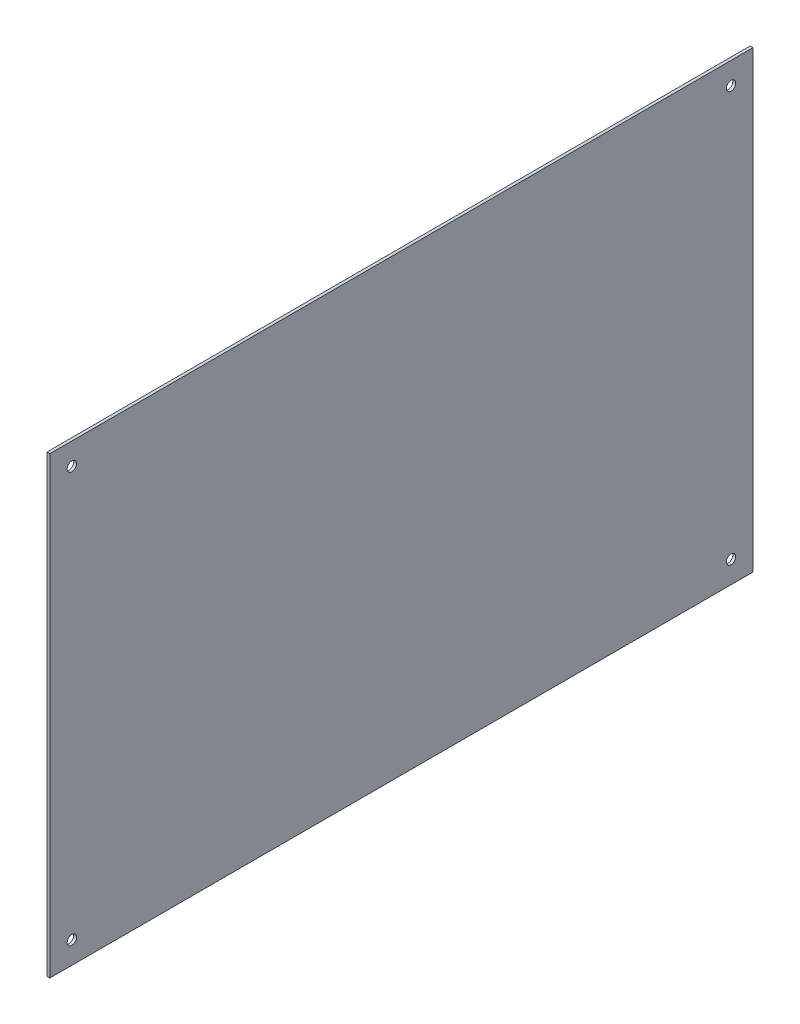
ISO-10303-21;
HEADER;
FILE_DESCRIPTION(('STEP AP214'),'2;1');
FILE_NAME('part.step','',(''),(''),'','','');
FILE_SCHEMA(('AUTOMOTIVE_DESIGN { 1 0 10303 214 1 1 1 1 }'));
ENDSEC;
DATA;
#1=APPLICATION_CONTEXT('core data for automotive mechanical design processes');
#2=APPLICATION_PROTOCOL_DEFINITION('international standard','automotive_design',2000,#1);
#3=PRODUCT_CONTEXT('',#1,'mechanical');
#4=PRODUCT('Part','Part','',(#3));
#5=PRODUCT_RELATED_PRODUCT_CATEGORY('part','',(#4));
#6=PRODUCT_DEFINITION_FORMATION('','',#4);
#7=PRODUCT_DEFINITION_CONTEXT('part definition',#1,'design');
#8=PRODUCT_DEFINITION('design','',#6,#7);
#9=PRODUCT_DEFINITION_SHAPE('','',#8);
#10=(LENGTH_UNIT() NAMED_UNIT(*) SI_UNIT(.MILLI.,.METRE.));
#11=(NAMED_UNIT(*) PLANE_ANGLE_UNIT() SI_UNIT($,.RADIAN.));
#12=(NAMED_UNIT(*) SI_UNIT($,.STERADIAN.) SOLID_ANGLE_UNIT());
#13=UNCERTAINTY_MEASURE_WITH_UNIT(LENGTH_MEASURE(1.E-05),#10,'distance_accuracy_value','');
#14=(GEOMETRIC_REPRESENTATION_CONTEXT(3) GLOBAL_UNCERTAINTY_ASSIGNED_CONTEXT((#13)) GLOBAL_UNIT_ASSIGNED_CONTEXT((#10,
#11,#12)) REPRESENTATION_CONTEXT('',''));
#15=CARTESIAN_POINT('',(0.,0.,0.));
#16=DIRECTION('',(0.,0.,1.));
#17=DIRECTION('',(1.,0.,0.));
#18=AXIS2_PLACEMENT_3D('',#15,#16,#17);
#19=CARTESIAN_POINT('',(1.,0.,0.));
#20=DIRECTION('',(-1.,0.,0.));
#21=DIRECTION('',(0.,0.,1.));
#22=AXIS2_PLACEMENT_3D('',#19,#20,#21);
#23=PLANE('',#22);
#24=DIRECTION('',(0.,1.,0.));
#25=VECTOR('',#24,1.);
#26=CARTESIAN_POINT('',(1.,-77.5,-120.));
#27=LINE('',#26,#25);
#28=CARTESIAN_POINT('',(1.,-77.5,-120.));
#29=VERTEX_POINT('',#28);
#30=CARTESIAN_POINT('',(1.,77.5,-120.));
#31=VERTEX_POINT('',#30);
#32=EDGE_CURVE('E92',#29,#31,#27,.T.);
#33=ORIENTED_EDGE('',*,*,#32,.T.);
#34=DIRECTION('',(0.,0.,1.));
#35=VECTOR('',#34,1.);
#36=CARTESIAN_POINT('',(1.,77.5,120.));
#37=LINE('',#36,#35);
#38=CARTESIAN_POINT('',(1.,77.5,120.));
#39=VERTEX_POINT('',#38);
#40=EDGE_CURVE('E87',#31,#39,#37,.T.);
#41=ORIENTED_EDGE('',*,*,#40,.T.);
#42=DIRECTION('',(0.,-1.,0.));
#43=VECTOR('',#42,1.);
#44=CARTESIAN_POINT('',(1.,-77.5,120.));
#45=LINE('',#44,#43);
#46=CARTESIAN_POINT('',(1.,-77.5,120.));
#47=VERTEX_POINT('',#46);
#48=EDGE_CURVE('E90',#39,#47,#45,.T.);
#49=ORIENTED_EDGE('',*,*,#48,.T.);
#50=DIRECTION('',(0.,0.,-1.));
#51=VECTOR('',#50,1.);
#52=CARTESIAN_POINT('',(1.,-77.5,120.));
#53=LINE('',#52,#51);
#54=EDGE_CURVE('E57',#47,#29,#53,.T.);
#55=ORIENTED_EDGE('',*,*,#54,.T.);
#56=EDGE_LOOP('',(#33,#41,#49,#55));
#57=FACE_BOUND('',#56,.T.);
#58=CARTESIAN_POINT('',(1.,70.,112.5));
#59=DIRECTION('',(1.,0.,0.));
#60=DIRECTION('',(0.,0.,-1.));
#61=AXIS2_PLACEMENT_3D('',#58,#59,#60);
#62=CIRCLE('',#61,1.60000000000001);
#63=CARTESIAN_POINT('',(1.,70.,110.9));
#64=VERTEX_POINT('',#63);
#65=EDGE_CURVE('E112',#64,#64,#62,.T.);
#66=ORIENTED_EDGE('',*,*,#65,.F.);
#67=EDGE_LOOP('',(#66));
#68=FACE_BOUND('',#67,.T.);
#69=CARTESIAN_POINT('',(1.,-70.,112.5));
#70=DIRECTION('',(1.,0.,0.));
#71=DIRECTION('',(0.,0.,-1.));
#72=AXIS2_PLACEMENT_3D('',#69,#70,#71);
#73=CIRCLE('',#72,1.60000000000001);
#74=CARTESIAN_POINT('',(1.,-70.,110.9));
#75=VERTEX_POINT('',#74);
#76=EDGE_CURVE('E134',#75,#75,#73,.T.);
#77=ORIENTED_EDGE('',*,*,#76,.F.);
#78=EDGE_LOOP('',(#77));
#79=FACE_BOUND('',#78,.T.);
#80=CARTESIAN_POINT('',(1.,-70.,-112.5));
#81=DIRECTION('',(1.,0.,0.));
#82=DIRECTION('',(0.,0.,-1.));
#83=AXIS2_PLACEMENT_3D('',#80,#81,#82);
#84=CIRCLE('',#83,1.60000000000001);
#85=CARTESIAN_POINT('',(1.,-70.,-114.1));
#86=VERTEX_POINT('',#85);
#87=EDGE_CURVE('E142',#86,#86,#84,.T.);
#88=ORIENTED_EDGE('',*,*,#87,.F.);
#89=EDGE_LOOP('',(#88));
#90=FACE_BOUND('',#89,.T.);
#91=CARTESIAN_POINT('',(1.,70.,-112.5));
#92=DIRECTION('',(1.,0.,0.));
#93=DIRECTION('',(0.,0.,-1.));
#94=AXIS2_PLACEMENT_3D('',#91,#92,#93);
#95=CIRCLE('',#94,1.60000000000001);
#96=CARTESIAN_POINT('',(1.,70.,-114.1));
#97=VERTEX_POINT('',#96);
#98=EDGE_CURVE('E150',#97,#97,#95,.T.);
#99=ORIENTED_EDGE('',*,*,#98,.F.);
#100=EDGE_LOOP('',(#99));
#101=FACE_BOUND('',#100,.T.);
#102=ADVANCED_FACE('F39',(#57,#68,#79,#90,#101),#23,.F.);
#103=CARTESIAN_POINT('',(0.,0.,0.));
#104=DIRECTION('',(-1.,0.,0.));
#105=DIRECTION('',(0.,0.,1.));
#106=AXIS2_PLACEMENT_3D('',#103,#104,#105);
#107=PLANE('',#106);
#108=CARTESIAN_POINT('',(0.,-70.,-112.5));
#109=DIRECTION('',(1.,0.,0.));
#110=DIRECTION('',(0.,0.,-1.));
#111=AXIS2_PLACEMENT_3D('',#108,#109,#110);
#112=CIRCLE('',#111,1.60000000000001);
#113=CARTESIAN_POINT('',(0.,-70.,-114.1));
#114=VERTEX_POINT('',#113);
#115=EDGE_CURVE('E146',#114,#114,#112,.T.);
#116=ORIENTED_EDGE('',*,*,#115,.T.);
#117=EDGE_LOOP('',(#116));
#118=FACE_BOUND('',#117,.T.);
#119=CARTESIAN_POINT('',(0.,70.,112.5));
#120=DIRECTION('',(1.,0.,0.));
#121=DIRECTION('',(0.,0.,-1.));
#122=AXIS2_PLACEMENT_3D('',#119,#120,#121);
#123=CIRCLE('',#122,1.60000000000001);
#124=CARTESIAN_POINT('',(0.,70.,110.9));
#125=VERTEX_POINT('',#124);
#126=EDGE_CURVE('E130',#125,#125,#123,.T.);
#127=ORIENTED_EDGE('',*,*,#126,.T.);
#128=EDGE_LOOP('',(#127));
#129=FACE_BOUND('',#128,.T.);
#130=DIRECTION('',(0.,1.,0.));
#131=VECTOR('',#130,1.);
#132=CARTESIAN_POINT('',(0.,-77.5,-120.));
#133=LINE('',#132,#131);
#134=CARTESIAN_POINT('',(0.,-77.5,-120.));
#135=VERTEX_POINT('',#134);
#136=CARTESIAN_POINT('',(0.,77.5,-120.));
#137=VERTEX_POINT('',#136);
#138=EDGE_CURVE('E108',#135,#137,#133,.T.);
#139=ORIENTED_EDGE('',*,*,#138,.F.);
#140=DIRECTION('',(0.,0.,-1.));
#141=VECTOR('',#140,1.);
#142=CARTESIAN_POINT('',(0.,-77.5,120.));
#143=LINE('',#142,#141);
#144=CARTESIAN_POINT('',(0.,-77.5,120.));
#145=VERTEX_POINT('',#144);
#146=EDGE_CURVE('E80',#145,#135,#143,.T.);
#147=ORIENTED_EDGE('',*,*,#146,.F.);
#148=DIRECTION('',(0.,-1.,0.));
#149=VECTOR('',#148,1.);
#150=CARTESIAN_POINT('',(0.,-77.5,120.));
#151=LINE('',#150,#149);
#152=CARTESIAN_POINT('',(0.,77.5,120.));
#153=VERTEX_POINT('',#152);
#154=EDGE_CURVE('E74',#153,#145,#151,.T.);
#155=ORIENTED_EDGE('',*,*,#154,.F.);
#156=DIRECTION('',(0.,0.,1.));
#157=VECTOR('',#156,1.);
#158=CARTESIAN_POINT('',(0.,77.5,120.));
#159=LINE('',#158,#157);
#160=EDGE_CURVE('E97',#137,#153,#159,.T.);
#161=ORIENTED_EDGE('',*,*,#160,.F.);
#162=EDGE_LOOP('',(#139,#147,#155,#161));
#163=FACE_BOUND('',#162,.T.);
#164=CARTESIAN_POINT('',(0.,-70.,112.5));
#165=DIRECTION('',(1.,0.,0.));
#166=DIRECTION('',(0.,0.,-1.));
#167=AXIS2_PLACEMENT_3D('',#164,#165,#166);
#168=CIRCLE('',#167,1.60000000000001);
#169=CARTESIAN_POINT('',(0.,-70.,110.9));
#170=VERTEX_POINT('',#169);
#171=EDGE_CURVE('E138',#170,#170,#168,.T.);
#172=ORIENTED_EDGE('',*,*,#171,.T.);
#173=EDGE_LOOP('',(#172));
#174=FACE_BOUND('',#173,.T.);
#175=CARTESIAN_POINT('',(0.,70.,-112.5));
#176=DIRECTION('',(1.,0.,0.));
#177=DIRECTION('',(0.,0.,-1.));
#178=AXIS2_PLACEMENT_3D('',#175,#176,#177);
#179=CIRCLE('',#178,1.60000000000001);
#180=CARTESIAN_POINT('',(0.,70.,-114.1));
#181=VERTEX_POINT('',#180);
#182=EDGE_CURVE('E154',#181,#181,#179,.T.);
#183=ORIENTED_EDGE('',*,*,#182,.T.);
#184=EDGE_LOOP('',(#183));
#185=FACE_BOUND('',#184,.T.);
#186=ADVANCED_FACE('F125',(#118,#129,#163,#174,#185),#107,.T.);
#187=CARTESIAN_POINT('',(1.,-77.5,-120.));
#188=DIRECTION('',(0.,0.,1.));
#189=DIRECTION('',(1.,0.,0.));
#190=AXIS2_PLACEMENT_3D('',#187,#188,#189);
#191=PLANE('',#190);
#192=ORIENTED_EDGE('',*,*,#138,.T.);
#193=DIRECTION('',(-1.,0.,0.));
#194=VECTOR('',#193,1.);
#195=CARTESIAN_POINT('',(1.,77.5,-120.));
#196=LINE('',#195,#194);
#197=EDGE_CURVE('E11',#31,#137,#196,.T.);
#198=ORIENTED_EDGE('',*,*,#197,.F.);
#199=ORIENTED_EDGE('',*,*,#32,.F.);
#200=DIRECTION('',(-1.,0.,0.));
#201=VECTOR('',#200,1.);
#202=CARTESIAN_POINT('',(1.,-77.5,-120.));
#203=LINE('',#202,#201);
#204=EDGE_CURVE('E104',#29,#135,#203,.T.);
#205=ORIENTED_EDGE('',*,*,#204,.T.);
#206=EDGE_LOOP('',(#192,#198,#199,#205));
#207=FACE_BOUND('',#206,.T.);
#208=ADVANCED_FACE('F41',(#207),#191,.F.);
#209=CARTESIAN_POINT('',(1.,77.5,120.));
#210=DIRECTION('',(0.,-1.,0.));
#211=DIRECTION('',(0.,0.,-1.));
#212=AXIS2_PLACEMENT_3D('',#209,#210,#211);
#213=PLANE('',#212);
#214=ORIENTED_EDGE('',*,*,#160,.T.);
#215=DIRECTION('',(-1.,0.,0.));
#216=VECTOR('',#215,1.);
#217=CARTESIAN_POINT('',(1.,77.5,120.));
#218=LINE('',#217,#216);
#219=EDGE_CURVE('E49',#39,#153,#218,.T.);
#220=ORIENTED_EDGE('',*,*,#219,.F.);
#221=ORIENTED_EDGE('',*,*,#40,.F.);
#222=ORIENTED_EDGE('',*,*,#197,.T.);
#223=EDGE_LOOP('',(#214,#220,#221,#222));
#224=FACE_BOUND('',#223,.T.);
#225=ADVANCED_FACE('F96',(#224),#213,.F.);
#226=CARTESIAN_POINT('',(1.,-77.5,120.));
#227=DIRECTION('',(0.,0.,-1.));
#228=DIRECTION('',(-1.,0.,0.));
#229=AXIS2_PLACEMENT_3D('',#226,#227,#228);
#230=PLANE('',#229);
#231=ORIENTED_EDGE('',*,*,#154,.T.);
#232=DIRECTION('',(-1.,0.,0.));
#233=VECTOR('',#232,1.);
#234=CARTESIAN_POINT('',(1.,-77.5,120.));
#235=LINE('',#234,#233);
#236=EDGE_CURVE('E99',#47,#145,#235,.T.);
#237=ORIENTED_EDGE('',*,*,#236,.F.);
#238=ORIENTED_EDGE('',*,*,#48,.F.);
#239=ORIENTED_EDGE('',*,*,#219,.T.);
#240=EDGE_LOOP('',(#231,#237,#238,#239));
#241=FACE_BOUND('',#240,.T.);
#242=ADVANCED_FACE('F100',(#241),#230,.F.);
#243=CARTESIAN_POINT('',(1.,-77.5,120.));
#244=DIRECTION('',(0.,1.,0.));
#245=DIRECTION('',(0.,0.,1.));
#246=AXIS2_PLACEMENT_3D('',#243,#244,#245);
#247=PLANE('',#246);
#248=ORIENTED_EDGE('',*,*,#146,.T.);
#249=ORIENTED_EDGE('',*,*,#204,.F.);
#250=ORIENTED_EDGE('',*,*,#54,.F.);
#251=ORIENTED_EDGE('',*,*,#236,.T.);
#252=EDGE_LOOP('',(#248,#249,#250,#251));
#253=FACE_BOUND('',#252,.T.);
#254=ADVANCED_FACE('F122',(#253),#247,.F.);
#255=CARTESIAN_POINT('',(1.,70.,112.5));
#256=DIRECTION('',(-1.,0.,0.));
#257=DIRECTION('',(0.,0.,1.));
#258=AXIS2_PLACEMENT_3D('',#255,#256,#257);
#259=CYLINDRICAL_SURFACE('',#258,1.60000000000001);
#260=ORIENTED_EDGE('',*,*,#65,.T.);
#261=EDGE_LOOP('',(#260));
#262=FACE_BOUND('',#261,.T.);
#263=ORIENTED_EDGE('',*,*,#126,.F.);
#264=EDGE_LOOP('',(#263));
#265=FACE_BOUND('',#264,.T.);
#266=ADVANCED_FACE('F173',(#262,#265),#259,.F.);
#267=CARTESIAN_POINT('',(1.,-70.,112.5));
#268=DIRECTION('',(-1.,0.,0.));
#269=DIRECTION('',(0.,0.,1.));
#270=AXIS2_PLACEMENT_3D('',#267,#268,#269);
#271=CYLINDRICAL_SURFACE('',#270,1.60000000000001);
#272=ORIENTED_EDGE('',*,*,#76,.T.);
#273=EDGE_LOOP('',(#272));
#274=FACE_BOUND('',#273,.T.);
#275=ORIENTED_EDGE('',*,*,#171,.F.);
#276=EDGE_LOOP('',(#275));
#277=FACE_BOUND('',#276,.T.);
#278=ADVANCED_FACE('F219',(#274,#277),#271,.F.);
#279=CARTESIAN_POINT('',(1.,-70.,-112.5));
#280=DIRECTION('',(-1.,0.,0.));
#281=DIRECTION('',(0.,0.,1.));
#282=AXIS2_PLACEMENT_3D('',#279,#280,#281);
#283=CYLINDRICAL_SURFACE('',#282,1.60000000000001);
#284=ORIENTED_EDGE('',*,*,#87,.T.);
#285=EDGE_LOOP('',(#284));
#286=FACE_BOUND('',#285,.T.);
#287=ORIENTED_EDGE('',*,*,#115,.F.);
#288=EDGE_LOOP('',(#287));
#289=FACE_BOUND('',#288,.T.);
#290=ADVANCED_FACE('F227',(#286,#289),#283,.F.);
#291=CARTESIAN_POINT('',(1.,70.,-112.5));
#292=DIRECTION('',(-1.,0.,0.));
#293=DIRECTION('',(0.,0.,1.));
#294=AXIS2_PLACEMENT_3D('',#291,#292,#293);
#295=CYLINDRICAL_SURFACE('',#294,1.60000000000001);
#296=ORIENTED_EDGE('',*,*,#98,.T.);
#297=EDGE_LOOP('',(#296));
#298=FACE_BOUND('',#297,.T.);
#299=ORIENTED_EDGE('',*,*,#182,.F.);
#300=EDGE_LOOP('',(#299));
#301=FACE_BOUND('',#300,.T.);
#302=ADVANCED_FACE('F162',(#298,#301),#295,.F.);
#303=CLOSED_SHELL('',(#102,#186,#208,#225,#242,#254,#266,#278,#290,#302));
#304=MANIFOLD_SOLID_BREP('B2',#303);
#305=ADVANCED_BREP_SHAPE_REPRESENTATION('',(#18,#304),#14);
#306=SHAPE_DEFINITION_REPRESENTATION(#9,#305);
ENDSEC;
END-ISO-10303-21;
